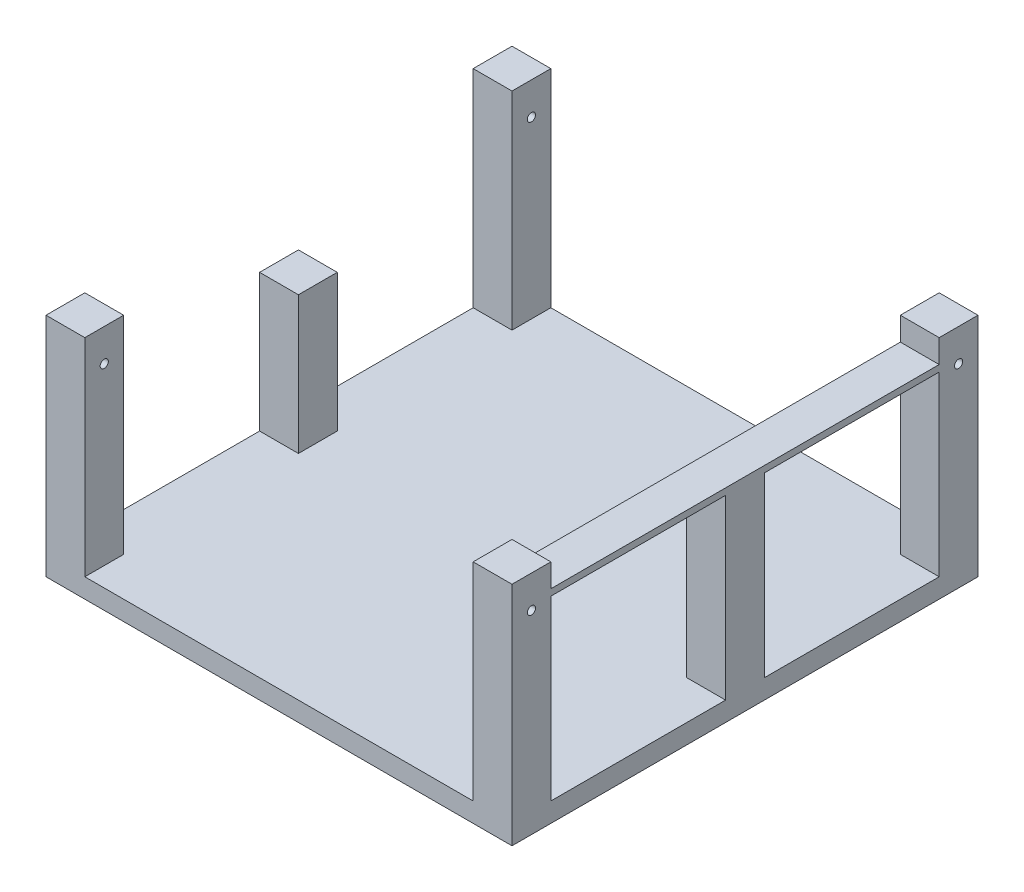
ISO-10303-21;
HEADER;
FILE_DESCRIPTION(('STEP AP214'),'2;1');
FILE_NAME('part.step','',(''),(''),'','','');
FILE_SCHEMA(('AUTOMOTIVE_DESIGN { 1 0 10303 214 1 1 1 1 }'));
ENDSEC;
DATA;
#1=APPLICATION_CONTEXT('core data for automotive mechanical design processes');
#2=APPLICATION_PROTOCOL_DEFINITION('international standard','automotive_design',2000,#1);
#3=PRODUCT_CONTEXT('',#1,'mechanical');
#4=PRODUCT('Part','Part','',(#3));
#5=PRODUCT_RELATED_PRODUCT_CATEGORY('part','',(#4));
#6=PRODUCT_DEFINITION_FORMATION('','',#4);
#7=PRODUCT_DEFINITION_CONTEXT('part definition',#1,'design');
#8=PRODUCT_DEFINITION('design','',#6,#7);
#9=PRODUCT_DEFINITION_SHAPE('','',#8);
#10=(LENGTH_UNIT() NAMED_UNIT(*) SI_UNIT(.MILLI.,.METRE.));
#11=(NAMED_UNIT(*) PLANE_ANGLE_UNIT() SI_UNIT($,.RADIAN.));
#12=(NAMED_UNIT(*) SI_UNIT($,.STERADIAN.) SOLID_ANGLE_UNIT());
#13=UNCERTAINTY_MEASURE_WITH_UNIT(LENGTH_MEASURE(1.E-05),#10,'distance_accuracy_value','');
#14=(GEOMETRIC_REPRESENTATION_CONTEXT(3) GLOBAL_UNCERTAINTY_ASSIGNED_CONTEXT((#13)) GLOBAL_UNIT_ASSIGNED_CONTEXT((#10,
#11,#12)) REPRESENTATION_CONTEXT('',''));
#15=CARTESIAN_POINT('',(0.,0.,0.));
#16=DIRECTION('',(0.,0.,1.));
#17=DIRECTION('',(1.,0.,0.));
#18=AXIS2_PLACEMENT_3D('',#15,#16,#17);
#19=CARTESIAN_POINT('',(228.6,222.25,-190.5));
#20=DIRECTION('',(0.,0.,-1.));
#21=DIRECTION('',(-1.,0.,0.));
#22=AXIS2_PLACEMENT_3D('',#19,#20,#21);
#23=PLANE('',#22);
#24=DIRECTION('',(-1.,0.,0.));
#25=VECTOR('',#24,1.);
#26=CARTESIAN_POINT('',(190.5,199.39,-190.5));
#27=LINE('',#26,#25);
#28=CARTESIAN_POINT('',(228.6,199.39,-190.5));
#29=VERTEX_POINT('',#28);
#30=CARTESIAN_POINT('',(190.5,199.39,-190.5));
#31=VERTEX_POINT('',#30);
#32=EDGE_CURVE('E226',#29,#31,#27,.T.);
#33=ORIENTED_EDGE('',*,*,#32,.F.);
#34=DIRECTION('',(0.,-1.,0.));
#35=VECTOR('',#34,1.);
#36=CARTESIAN_POINT('',(228.6,222.25,-190.5));
#37=LINE('',#36,#35);
#38=CARTESIAN_POINT('',(228.6,222.25,-190.5));
#39=VERTEX_POINT('',#38);
#40=EDGE_CURVE('E239',#39,#29,#37,.T.);
#41=ORIENTED_EDGE('',*,*,#40,.F.);
#42=DIRECTION('',(1.,0.,0.));
#43=VECTOR('',#42,1.);
#44=CARTESIAN_POINT('',(228.6,222.25,-190.5));
#45=LINE('',#44,#43);
#46=CARTESIAN_POINT('',(190.5,222.25,-190.5));
#47=VERTEX_POINT('',#46);
#48=EDGE_CURVE('E382',#47,#39,#45,.T.);
#49=ORIENTED_EDGE('',*,*,#48,.F.);
#50=DIRECTION('',(0.,-1.,0.));
#51=VECTOR('',#50,1.);
#52=CARTESIAN_POINT('',(190.5,222.25,-190.5));
#53=LINE('',#52,#51);
#54=EDGE_CURVE('E242',#47,#31,#53,.T.);
#55=ORIENTED_EDGE('',*,*,#54,.T.);
#56=EDGE_LOOP('',(#33,#41,#49,#55));
#57=FACE_BOUND('',#56,.T.);
#58=ADVANCED_FACE('F33',(#57),#23,.F.);
#59=CARTESIAN_POINT('',(228.6,222.25,190.5));
#60=DIRECTION('',(0.,0.,1.));
#61=DIRECTION('',(1.,0.,0.));
#62=AXIS2_PLACEMENT_3D('',#59,#60,#61);
#63=PLANE('',#62);
#64=DIRECTION('',(1.,0.,0.));
#65=VECTOR('',#64,1.);
#66=CARTESIAN_POINT('',(190.5,199.39,190.5));
#67=LINE('',#66,#65);
#68=CARTESIAN_POINT('',(190.5,199.39,190.5));
#69=VERTEX_POINT('',#68);
#70=CARTESIAN_POINT('',(228.6,199.39,190.5));
#71=VERTEX_POINT('',#70);
#72=EDGE_CURVE('E229',#69,#71,#67,.T.);
#73=ORIENTED_EDGE('',*,*,#72,.F.);
#74=DIRECTION('',(0.,-1.,0.));
#75=VECTOR('',#74,1.);
#76=CARTESIAN_POINT('',(190.5,222.25,190.5));
#77=LINE('',#76,#75);
#78=CARTESIAN_POINT('',(190.5,222.25,190.5));
#79=VERTEX_POINT('',#78);
#80=EDGE_CURVE('E320',#79,#69,#77,.T.);
#81=ORIENTED_EDGE('',*,*,#80,.F.);
#82=DIRECTION('',(-1.,0.,0.));
#83=VECTOR('',#82,1.);
#84=CARTESIAN_POINT('',(228.6,222.25,190.5));
#85=LINE('',#84,#83);
#86=CARTESIAN_POINT('',(228.6,222.25,190.5));
#87=VERTEX_POINT('',#86);
#88=EDGE_CURVE('E304',#87,#79,#85,.T.);
#89=ORIENTED_EDGE('',*,*,#88,.F.);
#90=DIRECTION('',(0.,-1.,0.));
#91=VECTOR('',#90,1.);
#92=CARTESIAN_POINT('',(228.6,222.25,190.5));
#93=LINE('',#92,#91);
#94=EDGE_CURVE('E324',#87,#71,#93,.T.);
#95=ORIENTED_EDGE('',*,*,#94,.T.);
#96=EDGE_LOOP('',(#73,#81,#89,#95));
#97=FACE_BOUND('',#96,.T.);
#98=ADVANCED_FACE('F461',(#97),#63,.F.);
#99=CARTESIAN_POINT('',(0.,19.05,0.));
#100=DIRECTION('',(0.,-1.,0.));
#101=DIRECTION('',(0.,0.,-1.));
#102=AXIS2_PLACEMENT_3D('',#99,#100,#101);
#103=PLANE('',#102);
#104=DIRECTION('',(-1.,0.,0.));
#105=VECTOR('',#104,1.);
#106=CARTESIAN_POINT('',(190.5,19.05,-19.05));
#107=LINE('',#106,#105);
#108=CARTESIAN_POINT('',(228.6,19.05,-19.05));
#109=VERTEX_POINT('',#108);
#110=CARTESIAN_POINT('',(190.5,19.05,-19.05));
#111=VERTEX_POINT('',#110);
#112=EDGE_CURVE('E464',#109,#111,#107,.T.);
#113=ORIENTED_EDGE('',*,*,#112,.F.);
#114=DIRECTION('',(0.,0.,-1.));
#115=VECTOR('',#114,1.);
#116=CARTESIAN_POINT('',(228.6,19.05,228.6));
#117=LINE('',#116,#115);
#118=CARTESIAN_POINT('',(228.6,19.05,-190.5));
#119=VERTEX_POINT('',#118);
#120=EDGE_CURVE('E262',#109,#119,#117,.T.);
#121=ORIENTED_EDGE('',*,*,#120,.T.);
#122=DIRECTION('',(1.,0.,0.));
#123=VECTOR('',#122,1.);
#124=CARTESIAN_POINT('',(228.6,19.05,-190.5));
#125=LINE('',#124,#123);
#126=CARTESIAN_POINT('',(190.5,19.05,-190.5));
#127=VERTEX_POINT('',#126);
#128=EDGE_CURVE('E252',#127,#119,#125,.T.);
#129=ORIENTED_EDGE('',*,*,#128,.F.);
#130=DIRECTION('',(0.,0.,1.));
#131=VECTOR('',#130,1.);
#132=CARTESIAN_POINT('',(190.5,19.05,-228.6));
#133=LINE('',#132,#131);
#134=CARTESIAN_POINT('',(190.5,19.05,-228.6));
#135=VERTEX_POINT('',#134);
#136=EDGE_CURVE('E376',#135,#127,#133,.T.);
#137=ORIENTED_EDGE('',*,*,#136,.F.);
#138=DIRECTION('',(-1.,0.,0.));
#139=VECTOR('',#138,1.);
#140=CARTESIAN_POINT('',(-228.6,19.05,-228.6));
#141=LINE('',#140,#139);
#142=CARTESIAN_POINT('',(-190.5,19.05,-228.6));
#143=VERTEX_POINT('',#142);
#144=EDGE_CURVE('E261',#135,#143,#141,.T.);
#145=ORIENTED_EDGE('',*,*,#144,.T.);
#146=DIRECTION('',(0.,0.,-1.));
#147=VECTOR('',#146,1.);
#148=CARTESIAN_POINT('',(-190.5,19.05,-228.6));
#149=LINE('',#148,#147);
#150=CARTESIAN_POINT('',(-190.5,19.05,-190.5));
#151=VERTEX_POINT('',#150);
#152=EDGE_CURVE('E331',#151,#143,#149,.T.);
#153=ORIENTED_EDGE('',*,*,#152,.F.);
#154=DIRECTION('',(1.,0.,0.));
#155=VECTOR('',#154,1.);
#156=CARTESIAN_POINT('',(-228.6,19.05,-190.5));
#157=LINE('',#156,#155);
#158=CARTESIAN_POINT('',(-228.6,19.05,-190.5));
#159=VERTEX_POINT('',#158);
#160=EDGE_CURVE('E326',#159,#151,#157,.T.);
#161=ORIENTED_EDGE('',*,*,#160,.F.);
#162=DIRECTION('',(0.,0.,1.));
#163=VECTOR('',#162,1.);
#164=CARTESIAN_POINT('',(-228.6,19.05,228.6));
#165=LINE('',#164,#163);
#166=CARTESIAN_POINT('',(-228.6,19.05,-19.05));
#167=VERTEX_POINT('',#166);
#168=EDGE_CURVE('E420',#159,#167,#165,.T.);
#169=ORIENTED_EDGE('',*,*,#168,.T.);
#170=DIRECTION('',(-1.,0.,0.));
#171=VECTOR('',#170,1.);
#172=CARTESIAN_POINT('',(-190.5,19.05,-19.05));
#173=LINE('',#172,#171);
#174=CARTESIAN_POINT('',(-190.5,19.05,-19.05));
#175=VERTEX_POINT('',#174);
#176=EDGE_CURVE('E505',#175,#167,#173,.T.);
#177=ORIENTED_EDGE('',*,*,#176,.F.);
#178=DIRECTION('',(0.,0.,-1.));
#179=VECTOR('',#178,1.);
#180=CARTESIAN_POINT('',(-190.5,19.05,19.05));
#181=LINE('',#180,#179);
#182=CARTESIAN_POINT('',(-190.5,19.05,19.05));
#183=VERTEX_POINT('',#182);
#184=EDGE_CURVE('E513',#183,#175,#181,.T.);
#185=ORIENTED_EDGE('',*,*,#184,.F.);
#186=DIRECTION('',(1.,0.,0.));
#187=VECTOR('',#186,1.);
#188=CARTESIAN_POINT('',(-190.5,19.05,19.05));
#189=LINE('',#188,#187);
#190=CARTESIAN_POINT('',(-228.6,19.05,19.05));
#191=VERTEX_POINT('',#190);
#192=EDGE_CURVE('E429',#191,#183,#189,.T.);
#193=ORIENTED_EDGE('',*,*,#192,.F.);
#194=CARTESIAN_POINT('',(-228.6,19.05,190.5));
#195=VERTEX_POINT('',#194);
#196=EDGE_CURVE('E405',#191,#195,#165,.T.);
#197=ORIENTED_EDGE('',*,*,#196,.T.);
#198=DIRECTION('',(-1.,0.,0.));
#199=VECTOR('',#198,1.);
#200=CARTESIAN_POINT('',(-228.6,19.05,190.5));
#201=LINE('',#200,#199);
#202=CARTESIAN_POINT('',(-190.5,19.05,190.5));
#203=VERTEX_POINT('',#202);
#204=EDGE_CURVE('E356',#203,#195,#201,.T.);
#205=ORIENTED_EDGE('',*,*,#204,.F.);
#206=DIRECTION('',(0.,0.,-1.));
#207=VECTOR('',#206,1.);
#208=CARTESIAN_POINT('',(-190.5,19.05,228.6));
#209=LINE('',#208,#207);
#210=CARTESIAN_POINT('',(-190.5,19.05,228.6));
#211=VERTEX_POINT('',#210);
#212=EDGE_CURVE('E351',#211,#203,#209,.T.);
#213=ORIENTED_EDGE('',*,*,#212,.F.);
#214=DIRECTION('',(1.,0.,0.));
#215=VECTOR('',#214,1.);
#216=CARTESIAN_POINT('',(-228.6,19.05,228.6));
#217=LINE('',#216,#215);
#218=CARTESIAN_POINT('',(190.5,19.05,228.6));
#219=VERTEX_POINT('',#218);
#220=EDGE_CURVE('E415',#211,#219,#217,.T.);
#221=ORIENTED_EDGE('',*,*,#220,.T.);
#222=DIRECTION('',(0.,0.,1.));
#223=VECTOR('',#222,1.);
#224=CARTESIAN_POINT('',(190.5,19.05,228.6));
#225=LINE('',#224,#223);
#226=CARTESIAN_POINT('',(190.5,19.05,190.5));
#227=VERTEX_POINT('',#226);
#228=EDGE_CURVE('E305',#227,#219,#225,.T.);
#229=ORIENTED_EDGE('',*,*,#228,.F.);
#230=DIRECTION('',(-1.,0.,0.));
#231=VECTOR('',#230,1.);
#232=CARTESIAN_POINT('',(228.6,19.05,190.5));
#233=LINE('',#232,#231);
#234=CARTESIAN_POINT('',(228.6,19.05,190.5));
#235=VERTEX_POINT('',#234);
#236=EDGE_CURVE('E300',#235,#227,#233,.T.);
#237=ORIENTED_EDGE('',*,*,#236,.F.);
#238=CARTESIAN_POINT('',(228.6,19.05,19.05));
#239=VERTEX_POINT('',#238);
#240=EDGE_CURVE('E257',#235,#239,#117,.T.);
#241=ORIENTED_EDGE('',*,*,#240,.T.);
#242=DIRECTION('',(1.,0.,0.));
#243=VECTOR('',#242,1.);
#244=CARTESIAN_POINT('',(190.5,19.05,19.05));
#245=LINE('',#244,#243);
#246=CARTESIAN_POINT('',(190.5,19.05,19.05));
#247=VERTEX_POINT('',#246);
#248=EDGE_CURVE('E479',#247,#239,#245,.T.);
#249=ORIENTED_EDGE('',*,*,#248,.F.);
#250=DIRECTION('',(0.,0.,1.));
#251=VECTOR('',#250,1.);
#252=CARTESIAN_POINT('',(190.5,19.05,19.05));
#253=LINE('',#252,#251);
#254=EDGE_CURVE('E485',#111,#247,#253,.T.);
#255=ORIENTED_EDGE('',*,*,#254,.F.);
#256=EDGE_LOOP('',(#113,#121,#129,#137,#145,#153,#161,#169,#177,#185,#193,#197,#205,#213,#221,
#229,#237,#241,#249,#255));
#257=FACE_BOUND('',#256,.T.);
#258=ADVANCED_FACE('F426',(#257),#103,.F.);
#259=CARTESIAN_POINT('',(228.6,19.05,228.6));
#260=DIRECTION('',(-1.,0.,0.));
#261=DIRECTION('',(0.,0.,1.));
#262=AXIS2_PLACEMENT_3D('',#259,#260,#261);
#263=PLANE('',#262);
#264=DIRECTION('',(0.,0.,-1.));
#265=VECTOR('',#264,1.);
#266=CARTESIAN_POINT('',(228.6,193.04,190.5));
#267=LINE('',#266,#265);
#268=CARTESIAN_POINT('',(228.6,193.04,-19.05));
#269=VERTEX_POINT('',#268);
#270=CARTESIAN_POINT('',(228.6,193.04,-190.5));
#271=VERTEX_POINT('',#270);
#272=EDGE_CURVE('E471',#269,#271,#267,.T.);
#273=ORIENTED_EDGE('',*,*,#272,.T.);
#274=EDGE_CURVE('E37',#271,#119,#37,.T.);
#275=ORIENTED_EDGE('',*,*,#274,.T.);
#276=ORIENTED_EDGE('',*,*,#120,.F.);
#277=DIRECTION('',(0.,-1.,0.));
#278=VECTOR('',#277,1.);
#279=CARTESIAN_POINT('',(228.6,193.04,-19.05));
#280=LINE('',#279,#278);
#281=EDGE_CURVE('E498',#269,#109,#280,.T.);
#282=ORIENTED_EDGE('',*,*,#281,.F.);
#283=EDGE_LOOP('',(#273,#275,#276,#282));
#284=FACE_BOUND('',#283,.T.);
#285=CARTESIAN_POINT('',(228.6,193.04,190.5));
#286=VERTEX_POINT('',#285);
#287=EDGE_CURVE('E323',#286,#235,#93,.T.);
#288=ORIENTED_EDGE('',*,*,#287,.F.);
#289=CARTESIAN_POINT('',(228.6,193.04,19.05));
#290=VERTEX_POINT('',#289);
#291=EDGE_CURVE('E467',#286,#290,#267,.T.);
#292=ORIENTED_EDGE('',*,*,#291,.T.);
#293=DIRECTION('',(0.,-1.,0.));
#294=VECTOR('',#293,1.);
#295=CARTESIAN_POINT('',(228.6,193.04,19.05));
#296=LINE('',#295,#294);
#297=EDGE_CURVE('E482',#290,#239,#296,.T.);
#298=ORIENTED_EDGE('',*,*,#297,.T.);
#299=ORIENTED_EDGE('',*,*,#240,.F.);
#300=EDGE_LOOP('',(#288,#292,#298,#299));
#301=FACE_BOUND('',#300,.T.);
#302=CARTESIAN_POINT('',(228.6,190.5,209.55));
#303=DIRECTION('',(-1.,0.,0.));
#304=DIRECTION('',(0.,0.,-1.));
#305=AXIS2_PLACEMENT_3D('',#302,#303,#304);
#306=CIRCLE('',#305,3.99999999999999);
#307=CARTESIAN_POINT('',(228.6,190.5,205.55));
#308=VERTEX_POINT('',#307);
#309=EDGE_CURVE('E275',#308,#308,#306,.T.);
#310=ORIENTED_EDGE('',*,*,#309,.T.);
#311=EDGE_LOOP('',(#310));
#312=FACE_BOUND('',#311,.T.);
#313=CARTESIAN_POINT('',(228.6,190.5,-209.55));
#314=DIRECTION('',(-1.,0.,0.));
#315=DIRECTION('',(0.,0.,1.));
#316=AXIS2_PLACEMENT_3D('',#313,#314,#315);
#317=CIRCLE('',#316,3.99999999999999);
#318=CARTESIAN_POINT('',(228.6,190.5,-205.55));
#319=VERTEX_POINT('',#318);
#320=EDGE_CURVE('E292',#319,#319,#317,.T.);
#321=ORIENTED_EDGE('',*,*,#320,.T.);
#322=EDGE_LOOP('',(#321));
#323=FACE_BOUND('',#322,.T.);
#324=DIRECTION('',(0.,0.,-1.));
#325=VECTOR('',#324,1.);
#326=CARTESIAN_POINT('',(228.6,0.,228.6));
#327=LINE('',#326,#325);
#328=CARTESIAN_POINT('',(228.6,0.,228.6));
#329=VERTEX_POINT('',#328);
#330=CARTESIAN_POINT('',(228.6,0.,-228.6));
#331=VERTEX_POINT('',#330);
#332=EDGE_CURVE('E396',#329,#331,#327,.T.);
#333=ORIENTED_EDGE('',*,*,#332,.T.);
#334=DIRECTION('',(0.,-1.,0.));
#335=VECTOR('',#334,1.);
#336=CARTESIAN_POINT('',(228.6,19.05,-228.6));
#337=LINE('',#336,#335);
#338=CARTESIAN_POINT('',(228.6,222.25,-228.6));
#339=VERTEX_POINT('',#338);
#340=EDGE_CURVE('E11',#339,#331,#337,.T.);
#341=ORIENTED_EDGE('',*,*,#340,.F.);
#342=DIRECTION('',(0.,0.,-1.));
#343=VECTOR('',#342,1.);
#344=CARTESIAN_POINT('',(228.6,222.25,-228.6));
#345=LINE('',#344,#343);
#346=EDGE_CURVE('E247',#39,#339,#345,.T.);
#347=ORIENTED_EDGE('',*,*,#346,.F.);
#348=ORIENTED_EDGE('',*,*,#40,.T.);
#349=DIRECTION('',(0.,0.,-1.));
#350=VECTOR('',#349,1.);
#351=CARTESIAN_POINT('',(228.6,199.39,190.5));
#352=LINE('',#351,#350);
#353=EDGE_CURVE('E223',#71,#29,#352,.T.);
#354=ORIENTED_EDGE('',*,*,#353,.F.);
#355=ORIENTED_EDGE('',*,*,#94,.F.);
#356=DIRECTION('',(0.,0.,-1.));
#357=VECTOR('',#356,1.);
#358=CARTESIAN_POINT('',(228.6,222.25,228.6));
#359=LINE('',#358,#357);
#360=CARTESIAN_POINT('',(228.6,222.25,228.6));
#361=VERTEX_POINT('',#360);
#362=EDGE_CURVE('E301',#361,#87,#359,.T.);
#363=ORIENTED_EDGE('',*,*,#362,.F.);
#364=DIRECTION('',(0.,-1.,0.));
#365=VECTOR('',#364,1.);
#366=CARTESIAN_POINT('',(228.6,19.05,228.6));
#367=LINE('',#366,#365);
#368=EDGE_CURVE('E412',#361,#329,#367,.T.);
#369=ORIENTED_EDGE('',*,*,#368,.T.);
#370=EDGE_LOOP('',(#333,#341,#347,#348,#354,#355,#363,#369));
#371=FACE_BOUND('',#370,.T.);
#372=ADVANCED_FACE('F35',(#284,#301,#312,#323,#371),#263,.F.);
#373=CARTESIAN_POINT('',(-228.6,19.05,-228.6));
#374=DIRECTION('',(0.,0.,1.));
#375=DIRECTION('',(1.,0.,0.));
#376=AXIS2_PLACEMENT_3D('',#373,#374,#375);
#377=PLANE('',#376);
#378=DIRECTION('',(-1.,0.,0.));
#379=VECTOR('',#378,1.);
#380=CARTESIAN_POINT('',(-228.6,0.,-228.6));
#381=LINE('',#380,#379);
#382=CARTESIAN_POINT('',(-228.6,0.,-228.6));
#383=VERTEX_POINT('',#382);
#384=EDGE_CURVE('E398',#331,#383,#381,.T.);
#385=ORIENTED_EDGE('',*,*,#384,.T.);
#386=DIRECTION('',(0.,-1.,0.));
#387=VECTOR('',#386,1.);
#388=CARTESIAN_POINT('',(-228.6,19.05,-228.6));
#389=LINE('',#388,#387);
#390=CARTESIAN_POINT('',(-228.6,222.25,-228.6));
#391=VERTEX_POINT('',#390);
#392=EDGE_CURVE('E43',#391,#383,#389,.T.);
#393=ORIENTED_EDGE('',*,*,#392,.F.);
#394=DIRECTION('',(-1.,0.,0.));
#395=VECTOR('',#394,1.);
#396=CARTESIAN_POINT('',(-228.6,222.25,-228.6));
#397=LINE('',#396,#395);
#398=CARTESIAN_POINT('',(-190.5,222.25,-228.6));
#399=VERTEX_POINT('',#398);
#400=EDGE_CURVE('E335',#399,#391,#397,.T.);
#401=ORIENTED_EDGE('',*,*,#400,.F.);
#402=DIRECTION('',(0.,-1.,0.));
#403=VECTOR('',#402,1.);
#404=CARTESIAN_POINT('',(-190.5,222.25,-228.6));
#405=LINE('',#404,#403);
#406=EDGE_CURVE('E338',#399,#143,#405,.T.);
#407=ORIENTED_EDGE('',*,*,#406,.T.);
#408=ORIENTED_EDGE('',*,*,#144,.F.);
#409=DIRECTION('',(0.,-1.,0.));
#410=VECTOR('',#409,1.);
#411=CARTESIAN_POINT('',(190.5,222.25,-228.6));
#412=LINE('',#411,#410);
#413=CARTESIAN_POINT('',(190.5,222.25,-228.6));
#414=VERTEX_POINT('',#413);
#415=EDGE_CURVE('E393',#414,#135,#412,.T.);
#416=ORIENTED_EDGE('',*,*,#415,.F.);
#417=DIRECTION('',(-1.,0.,0.));
#418=VECTOR('',#417,1.);
#419=CARTESIAN_POINT('',(228.6,222.25,-228.6));
#420=LINE('',#419,#418);
#421=EDGE_CURVE('E377',#339,#414,#420,.T.);
#422=ORIENTED_EDGE('',*,*,#421,.F.);
#423=ORIENTED_EDGE('',*,*,#340,.T.);
#424=EDGE_LOOP('',(#385,#393,#401,#407,#408,#416,#422,#423));
#425=FACE_BOUND('',#424,.T.);
#426=ADVANCED_FACE('F390',(#425),#377,.F.);
#427=CARTESIAN_POINT('',(-228.6,19.05,228.6));
#428=DIRECTION('',(1.,0.,0.));
#429=DIRECTION('',(0.,0.,-1.));
#430=AXIS2_PLACEMENT_3D('',#427,#428,#429);
#431=PLANE('',#430);
#432=CARTESIAN_POINT('',(-228.6,190.5,209.55));
#433=DIRECTION('',(-1.,0.,0.));
#434=DIRECTION('',(0.,0.,-1.));
#435=AXIS2_PLACEMENT_3D('',#432,#433,#434);
#436=CIRCLE('',#435,3.99999999999999);
#437=CARTESIAN_POINT('',(-228.6,190.5,205.55));
#438=VERTEX_POINT('',#437);
#439=EDGE_CURVE('E282',#438,#438,#436,.T.);
#440=ORIENTED_EDGE('',*,*,#439,.F.);
#441=EDGE_LOOP('',(#440));
#442=FACE_BOUND('',#441,.T.);
#443=CARTESIAN_POINT('',(-228.6,190.5,-209.55));
#444=DIRECTION('',(-1.,0.,0.));
#445=DIRECTION('',(0.,0.,1.));
#446=AXIS2_PLACEMENT_3D('',#443,#444,#445);
#447=CIRCLE('',#446,3.99999999999999);
#448=CARTESIAN_POINT('',(-228.6,190.5,-205.55));
#449=VERTEX_POINT('',#448);
#450=EDGE_CURVE('E279',#449,#449,#447,.T.);
#451=ORIENTED_EDGE('',*,*,#450,.F.);
#452=EDGE_LOOP('',(#451));
#453=FACE_BOUND('',#452,.T.);
#454=DIRECTION('',(0.,0.,1.));
#455=VECTOR('',#454,1.);
#456=CARTESIAN_POINT('',(-228.6,0.,228.6));
#457=LINE('',#456,#455);
#458=CARTESIAN_POINT('',(-228.6,0.,228.6));
#459=VERTEX_POINT('',#458);
#460=EDGE_CURVE('E417',#383,#459,#457,.T.);
#461=ORIENTED_EDGE('',*,*,#460,.T.);
#462=DIRECTION('',(0.,-1.,0.));
#463=VECTOR('',#462,1.);
#464=CARTESIAN_POINT('',(-228.6,19.05,228.6));
#465=LINE('',#464,#463);
#466=CARTESIAN_POINT('',(-228.6,222.25,228.6));
#467=VERTEX_POINT('',#466);
#468=EDGE_CURVE('E409',#467,#459,#465,.T.);
#469=ORIENTED_EDGE('',*,*,#468,.F.);
#470=DIRECTION('',(0.,0.,1.));
#471=VECTOR('',#470,1.);
#472=CARTESIAN_POINT('',(-228.6,222.25,228.6));
#473=LINE('',#472,#471);
#474=CARTESIAN_POINT('',(-228.6,222.25,190.5));
#475=VERTEX_POINT('',#474);
#476=EDGE_CURVE('E360',#475,#467,#473,.T.);
#477=ORIENTED_EDGE('',*,*,#476,.F.);
#478=DIRECTION('',(0.,-1.,0.));
#479=VECTOR('',#478,1.);
#480=CARTESIAN_POINT('',(-228.6,222.25,190.5));
#481=LINE('',#480,#479);
#482=EDGE_CURVE('E363',#475,#195,#481,.T.);
#483=ORIENTED_EDGE('',*,*,#482,.T.);
#484=ORIENTED_EDGE('',*,*,#196,.F.);
#485=DIRECTION('',(0.,-1.,0.));
#486=VECTOR('',#485,1.);
#487=CARTESIAN_POINT('',(-228.6,153.924,19.05));
#488=LINE('',#487,#486);
#489=CARTESIAN_POINT('',(-228.6,153.924,19.05));
#490=VERTEX_POINT('',#489);
#491=EDGE_CURVE('E287',#490,#191,#488,.T.);
#492=ORIENTED_EDGE('',*,*,#491,.F.);
#493=DIRECTION('',(0.,0.,1.));
#494=VECTOR('',#493,1.);
#495=CARTESIAN_POINT('',(-228.6,153.924,19.05));
#496=LINE('',#495,#494);
#497=CARTESIAN_POINT('',(-228.6,153.924,-19.05));
#498=VERTEX_POINT('',#497);
#499=EDGE_CURVE('E501',#498,#490,#496,.T.);
#500=ORIENTED_EDGE('',*,*,#499,.F.);
#501=DIRECTION('',(0.,-1.,0.));
#502=VECTOR('',#501,1.);
#503=CARTESIAN_POINT('',(-228.6,153.924,-19.05));
#504=LINE('',#503,#502);
#505=EDGE_CURVE('E511',#498,#167,#504,.T.);
#506=ORIENTED_EDGE('',*,*,#505,.T.);
#507=ORIENTED_EDGE('',*,*,#168,.F.);
#508=DIRECTION('',(0.,-1.,0.));
#509=VECTOR('',#508,1.);
#510=CARTESIAN_POINT('',(-228.6,222.25,-190.5));
#511=LINE('',#510,#509);
#512=CARTESIAN_POINT('',(-228.6,222.25,-190.5));
#513=VERTEX_POINT('',#512);
#514=EDGE_CURVE('E348',#513,#159,#511,.T.);
#515=ORIENTED_EDGE('',*,*,#514,.F.);
#516=DIRECTION('',(0.,0.,1.));
#517=VECTOR('',#516,1.);
#518=CARTESIAN_POINT('',(-228.6,222.25,-228.6));
#519=LINE('',#518,#517);
#520=EDGE_CURVE('E327',#391,#513,#519,.T.);
#521=ORIENTED_EDGE('',*,*,#520,.F.);
#522=ORIENTED_EDGE('',*,*,#392,.T.);
#523=EDGE_LOOP('',(#461,#469,#477,#483,#484,#492,#500,#506,#507,#515,#521,#522));
#524=FACE_BOUND('',#523,.T.);
#525=ADVANCED_FACE('F439',(#442,#453,#524),#431,.F.);
#526=CARTESIAN_POINT('',(-228.6,19.05,228.6));
#527=DIRECTION('',(0.,0.,-1.));
#528=DIRECTION('',(-1.,0.,0.));
#529=AXIS2_PLACEMENT_3D('',#526,#527,#528);
#530=PLANE('',#529);
#531=DIRECTION('',(1.,0.,0.));
#532=VECTOR('',#531,1.);
#533=CARTESIAN_POINT('',(-228.6,0.,228.6));
#534=LINE('',#533,#532);
#535=EDGE_CURVE('E271',#459,#329,#534,.T.);
#536=ORIENTED_EDGE('',*,*,#535,.T.);
#537=ORIENTED_EDGE('',*,*,#368,.F.);
#538=DIRECTION('',(1.,0.,0.));
#539=VECTOR('',#538,1.);
#540=CARTESIAN_POINT('',(228.6,222.25,228.6));
#541=LINE('',#540,#539);
#542=CARTESIAN_POINT('',(190.5,222.25,228.6));
#543=VERTEX_POINT('',#542);
#544=EDGE_CURVE('E309',#543,#361,#541,.T.);
#545=ORIENTED_EDGE('',*,*,#544,.F.);
#546=DIRECTION('',(0.,-1.,0.));
#547=VECTOR('',#546,1.);
#548=CARTESIAN_POINT('',(190.5,222.25,228.6));
#549=LINE('',#548,#547);
#550=EDGE_CURVE('E312',#543,#219,#549,.T.);
#551=ORIENTED_EDGE('',*,*,#550,.T.);
#552=ORIENTED_EDGE('',*,*,#220,.F.);
#553=DIRECTION('',(0.,-1.,0.));
#554=VECTOR('',#553,1.);
#555=CARTESIAN_POINT('',(-190.5,222.25,228.6));
#556=LINE('',#555,#554);
#557=CARTESIAN_POINT('',(-190.5,222.25,228.6));
#558=VERTEX_POINT('',#557);
#559=EDGE_CURVE('E373',#558,#211,#556,.T.);
#560=ORIENTED_EDGE('',*,*,#559,.F.);
#561=DIRECTION('',(1.,0.,0.));
#562=VECTOR('',#561,1.);
#563=CARTESIAN_POINT('',(-228.6,222.25,228.6));
#564=LINE('',#563,#562);
#565=EDGE_CURVE('E352',#467,#558,#564,.T.);
#566=ORIENTED_EDGE('',*,*,#565,.F.);
#567=ORIENTED_EDGE('',*,*,#468,.T.);
#568=EDGE_LOOP('',(#536,#537,#545,#551,#552,#560,#566,#567));
#569=FACE_BOUND('',#568,.T.);
#570=ADVANCED_FACE('F445',(#569),#530,.F.);
#571=CARTESIAN_POINT('',(0.,0.,0.));
#572=DIRECTION('',(0.,-1.,0.));
#573=DIRECTION('',(0.,0.,-1.));
#574=AXIS2_PLACEMENT_3D('',#571,#572,#573);
#575=PLANE('',#574);
#576=ORIENTED_EDGE('',*,*,#332,.F.);
#577=ORIENTED_EDGE('',*,*,#535,.F.);
#578=ORIENTED_EDGE('',*,*,#460,.F.);
#579=ORIENTED_EDGE('',*,*,#384,.F.);
#580=EDGE_LOOP('',(#576,#577,#578,#579));
#581=FACE_BOUND('',#580,.T.);
#582=ADVANCED_FACE('F562',(#581),#575,.T.);
#583=CARTESIAN_POINT('',(190.5,222.25,-228.6));
#584=DIRECTION('',(1.,0.,0.));
#585=DIRECTION('',(0.,0.,-1.));
#586=AXIS2_PLACEMENT_3D('',#583,#584,#585);
#587=PLANE('',#586);
#588=CARTESIAN_POINT('',(190.5,190.5,-209.55));
#589=DIRECTION('',(1.,0.,0.));
#590=DIRECTION('',(0.,0.,-1.));
#591=AXIS2_PLACEMENT_3D('',#588,#589,#590);
#592=CIRCLE('',#591,3.99999999999999);
#593=CARTESIAN_POINT('',(190.5,190.5,-213.55));
#594=VERTEX_POINT('',#593);
#595=EDGE_CURVE('E297',#594,#594,#592,.T.);
#596=ORIENTED_EDGE('',*,*,#595,.T.);
#597=EDGE_LOOP('',(#596));
#598=FACE_BOUND('',#597,.T.);
#599=ORIENTED_EDGE('',*,*,#136,.T.);
#600=CARTESIAN_POINT('',(190.5,193.04,-190.5));
#601=VERTEX_POINT('',#600);
#602=EDGE_CURVE('E248',#601,#127,#53,.T.);
#603=ORIENTED_EDGE('',*,*,#602,.F.);
#604=DIRECTION('',(0.,0.,1.));
#605=VECTOR('',#604,1.);
#606=CARTESIAN_POINT('',(190.5,193.04,190.5));
#607=LINE('',#606,#605);
#608=CARTESIAN_POINT('',(190.5,193.04,-19.05));
#609=VERTEX_POINT('',#608);
#610=EDGE_CURVE('E51',#601,#609,#607,.T.);
#611=ORIENTED_EDGE('',*,*,#610,.T.);
#612=DIRECTION('',(0.,-1.,0.));
#613=VECTOR('',#612,1.);
#614=CARTESIAN_POINT('',(190.5,193.04,-19.05));
#615=LINE('',#614,#613);
#616=EDGE_CURVE('E495',#609,#111,#615,.T.);
#617=ORIENTED_EDGE('',*,*,#616,.T.);
#618=ORIENTED_EDGE('',*,*,#254,.T.);
#619=DIRECTION('',(0.,-1.,0.));
#620=VECTOR('',#619,1.);
#621=CARTESIAN_POINT('',(190.5,193.04,19.05));
#622=LINE('',#621,#620);
#623=CARTESIAN_POINT('',(190.5,193.04,19.05));
#624=VERTEX_POINT('',#623);
#625=EDGE_CURVE('E492',#624,#247,#622,.T.);
#626=ORIENTED_EDGE('',*,*,#625,.F.);
#627=CARTESIAN_POINT('',(190.5,193.04,190.5));
#628=VERTEX_POINT('',#627);
#629=EDGE_CURVE('E473',#624,#628,#607,.T.);
#630=ORIENTED_EDGE('',*,*,#629,.T.);
#631=EDGE_CURVE('E319',#628,#227,#77,.T.);
#632=ORIENTED_EDGE('',*,*,#631,.T.);
#633=ORIENTED_EDGE('',*,*,#228,.T.);
#634=ORIENTED_EDGE('',*,*,#550,.F.);
#635=DIRECTION('',(0.,0.,1.));
#636=VECTOR('',#635,1.);
#637=CARTESIAN_POINT('',(190.5,222.25,228.6));
#638=LINE('',#637,#636);
#639=EDGE_CURVE('E307',#79,#543,#638,.T.);
#640=ORIENTED_EDGE('',*,*,#639,.F.);
#641=ORIENTED_EDGE('',*,*,#80,.T.);
#642=DIRECTION('',(0.,0.,1.));
#643=VECTOR('',#642,1.);
#644=CARTESIAN_POINT('',(190.5,199.39,190.5));
#645=LINE('',#644,#643);
#646=EDGE_CURVE('E243',#31,#69,#645,.T.);
#647=ORIENTED_EDGE('',*,*,#646,.F.);
#648=ORIENTED_EDGE('',*,*,#54,.F.);
#649=DIRECTION('',(0.,0.,1.));
#650=VECTOR('',#649,1.);
#651=CARTESIAN_POINT('',(190.5,222.25,-228.6));
#652=LINE('',#651,#650);
#653=EDGE_CURVE('E380',#414,#47,#652,.T.);
#654=ORIENTED_EDGE('',*,*,#653,.F.);
#655=ORIENTED_EDGE('',*,*,#415,.T.);
#656=EDGE_LOOP('',(#599,#603,#611,#617,#618,#626,#630,#632,#633,#634,#640,#641,#647,#648,#654,#655));
#657=FACE_BOUND('',#656,.T.);
#658=CARTESIAN_POINT('',(190.5,190.5,209.55));
#659=DIRECTION('',(1.,0.,0.));
#660=DIRECTION('',(0.,0.,-1.));
#661=AXIS2_PLACEMENT_3D('',#658,#659,#660);
#662=CIRCLE('',#661,3.99999999999999);
#663=CARTESIAN_POINT('',(190.5,190.5,205.55));
#664=VERTEX_POINT('',#663);
#665=EDGE_CURVE('E272',#664,#664,#662,.T.);
#666=ORIENTED_EDGE('',*,*,#665,.T.);
#667=EDGE_LOOP('',(#666));
#668=FACE_BOUND('',#667,.T.);
#669=ADVANCED_FACE('F452',(#598,#657,#668),#587,.F.);
#670=ORIENTED_EDGE('',*,*,#274,.F.);
#671=DIRECTION('',(-1.,0.,0.));
#672=VECTOR('',#671,1.);
#673=CARTESIAN_POINT('',(190.5,193.04,-190.5));
#674=LINE('',#673,#672);
#675=EDGE_CURVE('E470',#271,#601,#674,.T.);
#676=ORIENTED_EDGE('',*,*,#675,.T.);
#677=ORIENTED_EDGE('',*,*,#602,.T.);
#678=ORIENTED_EDGE('',*,*,#128,.T.);
#679=EDGE_LOOP('',(#670,#676,#677,#678));
#680=FACE_BOUND('',#679,.T.);
#681=ADVANCED_FACE('F548',(#680),#23,.F.);
#682=CARTESIAN_POINT('',(0.,222.25,0.));
#683=DIRECTION('',(0.,1.,0.));
#684=DIRECTION('',(0.,0.,1.));
#685=AXIS2_PLACEMENT_3D('',#682,#683,#684);
#686=PLANE('',#685);
#687=ORIENTED_EDGE('',*,*,#421,.T.);
#688=ORIENTED_EDGE('',*,*,#653,.T.);
#689=ORIENTED_EDGE('',*,*,#48,.T.);
#690=ORIENTED_EDGE('',*,*,#346,.T.);
#691=EDGE_LOOP('',(#687,#688,#689,#690));
#692=FACE_BOUND('',#691,.T.);
#693=ADVANCED_FACE('F387',(#692),#686,.T.);
#694=CARTESIAN_POINT('',(-190.5,222.25,228.6));
#695=DIRECTION('',(-1.,0.,0.));
#696=DIRECTION('',(0.,0.,1.));
#697=AXIS2_PLACEMENT_3D('',#694,#695,#696);
#698=PLANE('',#697);
#699=CARTESIAN_POINT('',(-190.5,190.5,209.55));
#700=DIRECTION('',(-1.,0.,0.));
#701=DIRECTION('',(0.,0.,1.));
#702=AXIS2_PLACEMENT_3D('',#699,#700,#701);
#703=CIRCLE('',#702,3.99999999999999);
#704=CARTESIAN_POINT('',(-190.5,190.5,213.55));
#705=VERTEX_POINT('',#704);
#706=EDGE_CURVE('E274',#705,#705,#703,.T.);
#707=ORIENTED_EDGE('',*,*,#706,.T.);
#708=EDGE_LOOP('',(#707));
#709=FACE_BOUND('',#708,.T.);
#710=ORIENTED_EDGE('',*,*,#212,.T.);
#711=DIRECTION('',(0.,-1.,0.));
#712=VECTOR('',#711,1.);
#713=CARTESIAN_POINT('',(-190.5,222.25,190.5));
#714=LINE('',#713,#712);
#715=CARTESIAN_POINT('',(-190.5,222.25,190.5));
#716=VERTEX_POINT('',#715);
#717=EDGE_CURVE('E370',#716,#203,#714,.T.);
#718=ORIENTED_EDGE('',*,*,#717,.F.);
#719=DIRECTION('',(0.,0.,-1.));
#720=VECTOR('',#719,1.);
#721=CARTESIAN_POINT('',(-190.5,222.25,228.6));
#722=LINE('',#721,#720);
#723=EDGE_CURVE('E355',#558,#716,#722,.T.);
#724=ORIENTED_EDGE('',*,*,#723,.F.);
#725=ORIENTED_EDGE('',*,*,#559,.T.);
#726=EDGE_LOOP('',(#710,#718,#724,#725));
#727=FACE_BOUND('',#726,.T.);
#728=ADVANCED_FACE('F448',(#709,#727),#698,.F.);
#729=CARTESIAN_POINT('',(-228.6,222.25,190.5));
#730=DIRECTION('',(0.,0.,1.));
#731=DIRECTION('',(1.,0.,0.));
#732=AXIS2_PLACEMENT_3D('',#729,#730,#731);
#733=PLANE('',#732);
#734=ORIENTED_EDGE('',*,*,#204,.T.);
#735=ORIENTED_EDGE('',*,*,#482,.F.);
#736=DIRECTION('',(-1.,0.,0.));
#737=VECTOR('',#736,1.);
#738=CARTESIAN_POINT('',(-228.6,222.25,190.5));
#739=LINE('',#738,#737);
#740=EDGE_CURVE('E358',#716,#475,#739,.T.);
#741=ORIENTED_EDGE('',*,*,#740,.F.);
#742=ORIENTED_EDGE('',*,*,#717,.T.);
#743=EDGE_LOOP('',(#734,#735,#741,#742));
#744=FACE_BOUND('',#743,.T.);
#745=ADVANCED_FACE('F435',(#744),#733,.F.);
#746=CARTESIAN_POINT('',(0.,222.25,0.));
#747=DIRECTION('',(0.,1.,0.));
#748=DIRECTION('',(0.,0.,1.));
#749=AXIS2_PLACEMENT_3D('',#746,#747,#748);
#750=PLANE('',#749);
#751=ORIENTED_EDGE('',*,*,#565,.T.);
#752=ORIENTED_EDGE('',*,*,#723,.T.);
#753=ORIENTED_EDGE('',*,*,#740,.T.);
#754=ORIENTED_EDGE('',*,*,#476,.T.);
#755=EDGE_LOOP('',(#751,#752,#753,#754));
#756=FACE_BOUND('',#755,.T.);
#757=ADVANCED_FACE('F442',(#756),#750,.T.);
#758=CARTESIAN_POINT('',(-228.6,222.25,-190.5));
#759=DIRECTION('',(0.,0.,-1.));
#760=DIRECTION('',(-1.,0.,0.));
#761=AXIS2_PLACEMENT_3D('',#758,#759,#760);
#762=PLANE('',#761);
#763=ORIENTED_EDGE('',*,*,#160,.T.);
#764=DIRECTION('',(0.,-1.,0.));
#765=VECTOR('',#764,1.);
#766=CARTESIAN_POINT('',(-190.5,222.25,-190.5));
#767=LINE('',#766,#765);
#768=CARTESIAN_POINT('',(-190.5,222.25,-190.5));
#769=VERTEX_POINT('',#768);
#770=EDGE_CURVE('E345',#769,#151,#767,.T.);
#771=ORIENTED_EDGE('',*,*,#770,.F.);
#772=DIRECTION('',(1.,0.,0.));
#773=VECTOR('',#772,1.);
#774=CARTESIAN_POINT('',(-228.6,222.25,-190.5));
#775=LINE('',#774,#773);
#776=EDGE_CURVE('E330',#513,#769,#775,.T.);
#777=ORIENTED_EDGE('',*,*,#776,.F.);
#778=ORIENTED_EDGE('',*,*,#514,.T.);
#779=EDGE_LOOP('',(#763,#771,#777,#778));
#780=FACE_BOUND('',#779,.T.);
#781=ADVANCED_FACE('F587',(#780),#762,.F.);
#782=CARTESIAN_POINT('',(-190.5,222.25,-228.6));
#783=DIRECTION('',(-1.,0.,0.));
#784=DIRECTION('',(0.,0.,1.));
#785=AXIS2_PLACEMENT_3D('',#782,#783,#784);
#786=PLANE('',#785);
#787=CARTESIAN_POINT('',(-190.5,190.5,-209.55));
#788=DIRECTION('',(-1.,0.,0.));
#789=DIRECTION('',(0.,0.,1.));
#790=AXIS2_PLACEMENT_3D('',#787,#788,#789);
#791=CIRCLE('',#790,3.99999999999999);
#792=CARTESIAN_POINT('',(-190.5,190.5,-205.55));
#793=VERTEX_POINT('',#792);
#794=EDGE_CURVE('E263',#793,#793,#791,.T.);
#795=ORIENTED_EDGE('',*,*,#794,.T.);
#796=EDGE_LOOP('',(#795));
#797=FACE_BOUND('',#796,.T.);
#798=ORIENTED_EDGE('',*,*,#152,.T.);
#799=ORIENTED_EDGE('',*,*,#406,.F.);
#800=DIRECTION('',(0.,0.,-1.));
#801=VECTOR('',#800,1.);
#802=CARTESIAN_POINT('',(-190.5,222.25,-228.6));
#803=LINE('',#802,#801);
#804=EDGE_CURVE('E333',#769,#399,#803,.T.);
#805=ORIENTED_EDGE('',*,*,#804,.F.);
#806=ORIENTED_EDGE('',*,*,#770,.T.);
#807=EDGE_LOOP('',(#798,#799,#805,#806));
#808=FACE_BOUND('',#807,.T.);
#809=ADVANCED_FACE('F577',(#797,#808),#786,.F.);
#810=CARTESIAN_POINT('',(0.,222.25,0.));
#811=DIRECTION('',(0.,1.,0.));
#812=DIRECTION('',(0.,0.,1.));
#813=AXIS2_PLACEMENT_3D('',#810,#811,#812);
#814=PLANE('',#813);
#815=ORIENTED_EDGE('',*,*,#520,.T.);
#816=ORIENTED_EDGE('',*,*,#776,.T.);
#817=ORIENTED_EDGE('',*,*,#804,.T.);
#818=ORIENTED_EDGE('',*,*,#400,.T.);
#819=EDGE_LOOP('',(#815,#816,#817,#818));
#820=FACE_BOUND('',#819,.T.);
#821=ADVANCED_FACE('F583',(#820),#814,.T.);
#822=ORIENTED_EDGE('',*,*,#631,.F.);
#823=DIRECTION('',(1.,0.,0.));
#824=VECTOR('',#823,1.);
#825=CARTESIAN_POINT('',(190.5,193.04,190.5));
#826=LINE('',#825,#824);
#827=EDGE_CURVE('E59',#628,#286,#826,.T.);
#828=ORIENTED_EDGE('',*,*,#827,.T.);
#829=ORIENTED_EDGE('',*,*,#287,.T.);
#830=ORIENTED_EDGE('',*,*,#236,.T.);
#831=EDGE_LOOP('',(#822,#828,#829,#830));
#832=FACE_BOUND('',#831,.T.);
#833=ADVANCED_FACE('F553',(#832),#63,.F.);
#834=CARTESIAN_POINT('',(0.,222.25,0.));
#835=DIRECTION('',(0.,1.,0.));
#836=DIRECTION('',(0.,0.,1.));
#837=AXIS2_PLACEMENT_3D('',#834,#835,#836);
#838=PLANE('',#837);
#839=ORIENTED_EDGE('',*,*,#362,.T.);
#840=ORIENTED_EDGE('',*,*,#88,.T.);
#841=ORIENTED_EDGE('',*,*,#639,.T.);
#842=ORIENTED_EDGE('',*,*,#544,.T.);
#843=EDGE_LOOP('',(#839,#840,#841,#842));
#844=FACE_BOUND('',#843,.T.);
#845=ADVANCED_FACE('F458',(#844),#838,.T.);
#846=CARTESIAN_POINT('',(228.6,190.5,-209.55));
#847=DIRECTION('',(-1.,0.,0.));
#848=DIRECTION('',(0.,0.,1.));
#849=AXIS2_PLACEMENT_3D('',#846,#847,#848);
#850=CYLINDRICAL_SURFACE('',#849,3.99999999999999);
#851=ORIENTED_EDGE('',*,*,#450,.T.);
#852=EDGE_LOOP('',(#851));
#853=FACE_BOUND('',#852,.T.);
#854=ORIENTED_EDGE('',*,*,#794,.F.);
#855=EDGE_LOOP('',(#854));
#856=FACE_BOUND('',#855,.T.);
#857=ADVANCED_FACE('F619',(#853,#856),#850,.F.);
#858=ORIENTED_EDGE('',*,*,#320,.F.);
#859=EDGE_LOOP('',(#858));
#860=FACE_BOUND('',#859,.T.);
#861=ORIENTED_EDGE('',*,*,#595,.F.);
#862=EDGE_LOOP('',(#861));
#863=FACE_BOUND('',#862,.T.);
#864=ADVANCED_FACE('F614',(#860,#863),#850,.F.);
#865=CARTESIAN_POINT('',(228.6,190.5,209.55));
#866=DIRECTION('',(-1.,0.,0.));
#867=DIRECTION('',(0.,0.,1.));
#868=AXIS2_PLACEMENT_3D('',#865,#866,#867);
#869=CYLINDRICAL_SURFACE('',#868,3.99999999999999);
#870=ORIENTED_EDGE('',*,*,#309,.F.);
#871=EDGE_LOOP('',(#870));
#872=FACE_BOUND('',#871,.T.);
#873=ORIENTED_EDGE('',*,*,#665,.F.);
#874=EDGE_LOOP('',(#873));
#875=FACE_BOUND('',#874,.T.);
#876=ADVANCED_FACE('F608',(#872,#875),#869,.F.);
#877=ORIENTED_EDGE('',*,*,#439,.T.);
#878=EDGE_LOOP('',(#877));
#879=FACE_BOUND('',#878,.T.);
#880=ORIENTED_EDGE('',*,*,#706,.F.);
#881=EDGE_LOOP('',(#880));
#882=FACE_BOUND('',#881,.T.);
#883=ADVANCED_FACE('F544',(#879,#882),#869,.F.);
#884=CARTESIAN_POINT('',(-190.5,153.924,19.05));
#885=DIRECTION('',(0.,0.,-1.));
#886=DIRECTION('',(-1.,0.,0.));
#887=AXIS2_PLACEMENT_3D('',#884,#885,#886);
#888=PLANE('',#887);
#889=ORIENTED_EDGE('',*,*,#192,.T.);
#890=DIRECTION('',(0.,-1.,0.));
#891=VECTOR('',#890,1.);
#892=CARTESIAN_POINT('',(-190.5,153.924,19.05));
#893=LINE('',#892,#891);
#894=CARTESIAN_POINT('',(-190.5,153.924,19.05));
#895=VERTEX_POINT('',#894);
#896=EDGE_CURVE('E521',#895,#183,#893,.T.);
#897=ORIENTED_EDGE('',*,*,#896,.F.);
#898=DIRECTION('',(1.,0.,0.));
#899=VECTOR('',#898,1.);
#900=CARTESIAN_POINT('',(-190.5,153.924,19.05));
#901=LINE('',#900,#899);
#902=EDGE_CURVE('E504',#490,#895,#901,.T.);
#903=ORIENTED_EDGE('',*,*,#902,.F.);
#904=ORIENTED_EDGE('',*,*,#491,.T.);
#905=EDGE_LOOP('',(#889,#897,#903,#904));
#906=FACE_BOUND('',#905,.T.);
#907=ADVANCED_FACE('F527',(#906),#888,.F.);
#908=CARTESIAN_POINT('',(-190.5,153.924,19.05));
#909=DIRECTION('',(-1.,0.,0.));
#910=DIRECTION('',(0.,0.,1.));
#911=AXIS2_PLACEMENT_3D('',#908,#909,#910);
#912=PLANE('',#911);
#913=ORIENTED_EDGE('',*,*,#184,.T.);
#914=DIRECTION('',(0.,-1.,0.));
#915=VECTOR('',#914,1.);
#916=CARTESIAN_POINT('',(-190.5,153.924,-19.05));
#917=LINE('',#916,#915);
#918=CARTESIAN_POINT('',(-190.5,153.924,-19.05));
#919=VERTEX_POINT('',#918);
#920=EDGE_CURVE('E519',#919,#175,#917,.T.);
#921=ORIENTED_EDGE('',*,*,#920,.F.);
#922=DIRECTION('',(0.,0.,-1.));
#923=VECTOR('',#922,1.);
#924=CARTESIAN_POINT('',(-190.5,153.924,19.05));
#925=LINE('',#924,#923);
#926=EDGE_CURVE('E507',#895,#919,#925,.T.);
#927=ORIENTED_EDGE('',*,*,#926,.F.);
#928=ORIENTED_EDGE('',*,*,#896,.T.);
#929=EDGE_LOOP('',(#913,#921,#927,#928));
#930=FACE_BOUND('',#929,.T.);
#931=ADVANCED_FACE('F536',(#930),#912,.F.);
#932=CARTESIAN_POINT('',(-190.5,153.924,-19.05));
#933=DIRECTION('',(0.,0.,1.));
#934=DIRECTION('',(1.,0.,0.));
#935=AXIS2_PLACEMENT_3D('',#932,#933,#934);
#936=PLANE('',#935);
#937=ORIENTED_EDGE('',*,*,#176,.T.);
#938=ORIENTED_EDGE('',*,*,#505,.F.);
#939=DIRECTION('',(-1.,0.,0.));
#940=VECTOR('',#939,1.);
#941=CARTESIAN_POINT('',(-190.5,153.924,-19.05));
#942=LINE('',#941,#940);
#943=EDGE_CURVE('E509',#919,#498,#942,.T.);
#944=ORIENTED_EDGE('',*,*,#943,.F.);
#945=ORIENTED_EDGE('',*,*,#920,.T.);
#946=EDGE_LOOP('',(#937,#938,#944,#945));
#947=FACE_BOUND('',#946,.T.);
#948=ADVANCED_FACE('F535',(#947),#936,.F.);
#949=CARTESIAN_POINT('',(0.,153.924,0.));
#950=DIRECTION('',(0.,1.,0.));
#951=DIRECTION('',(0.,0.,1.));
#952=AXIS2_PLACEMENT_3D('',#949,#950,#951);
#953=PLANE('',#952);
#954=ORIENTED_EDGE('',*,*,#499,.T.);
#955=ORIENTED_EDGE('',*,*,#902,.T.);
#956=ORIENTED_EDGE('',*,*,#926,.T.);
#957=ORIENTED_EDGE('',*,*,#943,.T.);
#958=EDGE_LOOP('',(#954,#955,#956,#957));
#959=FACE_BOUND('',#958,.T.);
#960=ADVANCED_FACE('F531',(#959),#953,.T.);
#961=CARTESIAN_POINT('',(190.5,193.04,-19.05));
#962=DIRECTION('',(0.,0.,1.));
#963=DIRECTION('',(1.,0.,0.));
#964=AXIS2_PLACEMENT_3D('',#961,#962,#963);
#965=PLANE('',#964);
#966=ORIENTED_EDGE('',*,*,#112,.T.);
#967=ORIENTED_EDGE('',*,*,#616,.F.);
#968=DIRECTION('',(-1.,0.,0.));
#969=VECTOR('',#968,1.);
#970=CARTESIAN_POINT('',(190.5,193.04,-19.05));
#971=LINE('',#970,#969);
#972=EDGE_CURVE('E476',#269,#609,#971,.T.);
#973=ORIENTED_EDGE('',*,*,#972,.F.);
#974=ORIENTED_EDGE('',*,*,#281,.T.);
#975=EDGE_LOOP('',(#966,#967,#973,#974));
#976=FACE_BOUND('',#975,.T.);
#977=ADVANCED_FACE('F573',(#976),#965,.F.);
#978=CARTESIAN_POINT('',(190.5,193.04,19.05));
#979=DIRECTION('',(0.,0.,-1.));
#980=DIRECTION('',(-1.,0.,0.));
#981=AXIS2_PLACEMENT_3D('',#978,#979,#980);
#982=PLANE('',#981);
#983=ORIENTED_EDGE('',*,*,#248,.T.);
#984=ORIENTED_EDGE('',*,*,#297,.F.);
#985=DIRECTION('',(1.,0.,0.));
#986=VECTOR('',#985,1.);
#987=CARTESIAN_POINT('',(190.5,193.04,19.05));
#988=LINE('',#987,#986);
#989=EDGE_CURVE('E478',#624,#290,#988,.T.);
#990=ORIENTED_EDGE('',*,*,#989,.F.);
#991=ORIENTED_EDGE('',*,*,#625,.T.);
#992=EDGE_LOOP('',(#983,#984,#990,#991));
#993=FACE_BOUND('',#992,.T.);
#994=ADVANCED_FACE('F836',(#993),#982,.F.);
#995=CARTESIAN_POINT('',(0.,193.04,0.));
#996=DIRECTION('',(0.,-1.,0.));
#997=DIRECTION('',(0.,0.,-1.));
#998=AXIS2_PLACEMENT_3D('',#995,#996,#997);
#999=PLANE('',#998);
#1000=ORIENTED_EDGE('',*,*,#972,.T.);
#1001=ORIENTED_EDGE('',*,*,#610,.F.);
#1002=ORIENTED_EDGE('',*,*,#675,.F.);
#1003=ORIENTED_EDGE('',*,*,#272,.F.);
#1004=EDGE_LOOP('',(#1000,#1001,#1002,#1003));
#1005=FACE_BOUND('',#1004,.T.);
#1006=ADVANCED_FACE('F574',(#1005),#999,.T.);
#1007=ORIENTED_EDGE('',*,*,#989,.T.);
#1008=ORIENTED_EDGE('',*,*,#291,.F.);
#1009=ORIENTED_EDGE('',*,*,#827,.F.);
#1010=ORIENTED_EDGE('',*,*,#629,.F.);
#1011=EDGE_LOOP('',(#1007,#1008,#1009,#1010));
#1012=FACE_BOUND('',#1011,.T.);
#1013=ADVANCED_FACE('F851',(#1012),#999,.T.);
#1014=CARTESIAN_POINT('',(0.,199.39,0.));
#1015=DIRECTION('',(0.,-1.,0.));
#1016=DIRECTION('',(0.,0.,-1.));
#1017=AXIS2_PLACEMENT_3D('',#1014,#1015,#1016);
#1018=PLANE('',#1017);
#1019=ORIENTED_EDGE('',*,*,#353,.T.);
#1020=ORIENTED_EDGE('',*,*,#32,.T.);
#1021=ORIENTED_EDGE('',*,*,#646,.T.);
#1022=ORIENTED_EDGE('',*,*,#72,.T.);
#1023=EDGE_LOOP('',(#1019,#1020,#1021,#1022));
#1024=FACE_BOUND('',#1023,.T.);
#1025=ADVANCED_FACE('F225',(#1024),#1018,.F.);
#1026=CLOSED_SHELL('',(#58,#98,#258,#372,#426,#525,#570,#582,#669,#681,#693,#728,#745,#757,#781,
#809,#821,#833,#845,#857,#864,#876,#883,#907,#931,#948,#960,#977,#994,#1006,#1013,#1025));
#1027=MANIFOLD_SOLID_BREP('B2',#1026);
#1028=ADVANCED_BREP_SHAPE_REPRESENTATION('',(#18,#1027),#14);
#1029=SHAPE_DEFINITION_REPRESENTATION(#9,#1028);
ENDSEC;
END-ISO-10303-21;
